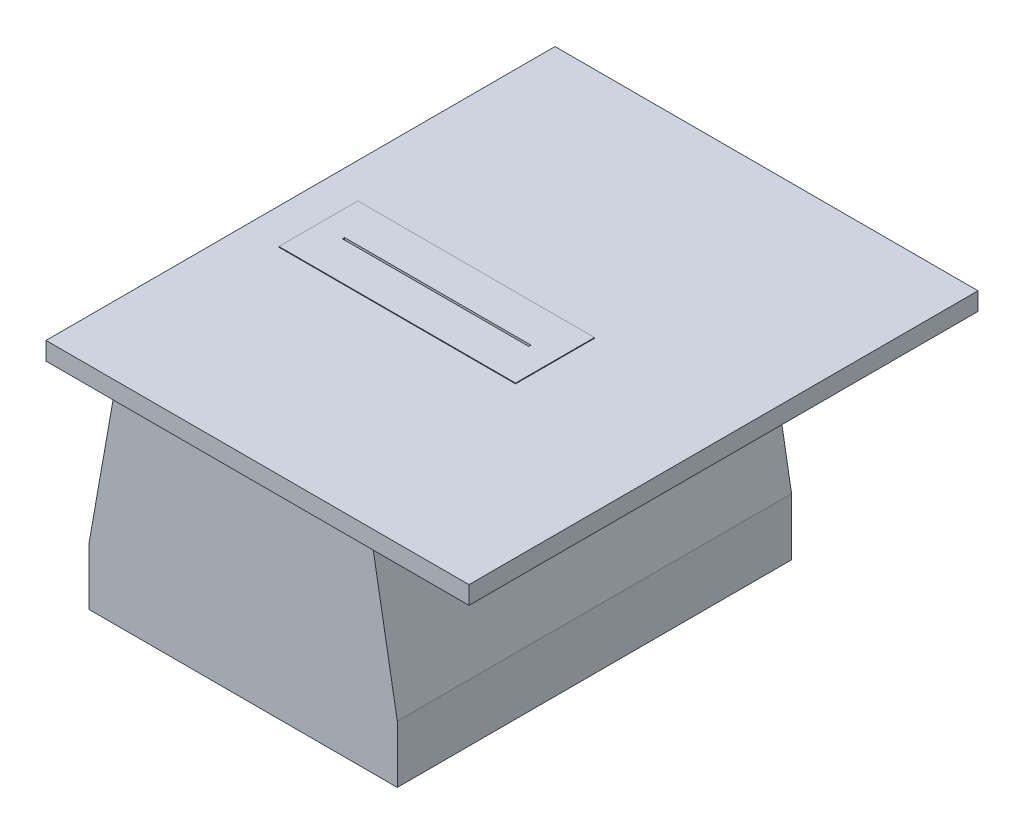
ISO-10303-21;
HEADER;
FILE_DESCRIPTION(('STEP AP214'),'2;1');
FILE_NAME('part.step','',(''),(''),'','','');
FILE_SCHEMA(('AUTOMOTIVE_DESIGN { 1 0 10303 214 1 1 1 1 }'));
ENDSEC;
DATA;
#1=APPLICATION_CONTEXT('core data for automotive mechanical design processes');
#2=APPLICATION_PROTOCOL_DEFINITION('international standard','automotive_design',2000,#1);
#3=PRODUCT_CONTEXT('',#1,'mechanical');
#4=PRODUCT('Part','Part','',(#3));
#5=PRODUCT_RELATED_PRODUCT_CATEGORY('part','',(#4));
#6=PRODUCT_DEFINITION_FORMATION('','',#4);
#7=PRODUCT_DEFINITION_CONTEXT('part definition',#1,'design');
#8=PRODUCT_DEFINITION('design','',#6,#7);
#9=PRODUCT_DEFINITION_SHAPE('','',#8);
#10=(LENGTH_UNIT() NAMED_UNIT(*) SI_UNIT(.MILLI.,.METRE.));
#11=(NAMED_UNIT(*) PLANE_ANGLE_UNIT() SI_UNIT($,.RADIAN.));
#12=(NAMED_UNIT(*) SI_UNIT($,.STERADIAN.) SOLID_ANGLE_UNIT());
#13=UNCERTAINTY_MEASURE_WITH_UNIT(LENGTH_MEASURE(1.E-05),#10,'distance_accuracy_value','');
#14=(GEOMETRIC_REPRESENTATION_CONTEXT(3) GLOBAL_UNCERTAINTY_ASSIGNED_CONTEXT((#13)) GLOBAL_UNIT_ASSIGNED_CONTEXT((#10,
#11,#12)) REPRESENTATION_CONTEXT('',''));
#15=CARTESIAN_POINT('',(0.,0.,0.));
#16=DIRECTION('',(0.,0.,1.));
#17=DIRECTION('',(1.,0.,0.));
#18=AXIS2_PLACEMENT_3D('',#15,#16,#17);
#19=CARTESIAN_POINT('',(215.,0.,550.));
#20=DIRECTION('',(-1.,0.,0.));
#21=DIRECTION('',(0.,-1.,0.));
#22=AXIS2_PLACEMENT_3D('',#19,#20,#21);
#23=PLANE('',#22);
#24=DIRECTION('',(0.,1.,0.));
#25=VECTOR('',#24,1.);
#26=CARTESIAN_POINT('',(215.,0.,0.));
#27=LINE('',#26,#25);
#28=CARTESIAN_POINT('',(215.,0.,0.));
#29=VERTEX_POINT('',#28);
#30=CARTESIAN_POINT('',(215.,80.0000000000001,0.));
#31=VERTEX_POINT('',#30);
#32=EDGE_CURVE('E255',#29,#31,#27,.T.);
#33=ORIENTED_EDGE('',*,*,#32,.T.);
#34=DIRECTION('',(0.,0.,-1.));
#35=VECTOR('',#34,1.);
#36=CARTESIAN_POINT('',(215.,80.0000000000001,550.));
#37=LINE('',#36,#35);
#38=CARTESIAN_POINT('',(215.,80.0000000000001,550.));
#39=VERTEX_POINT('',#38);
#40=EDGE_CURVE('E11',#39,#31,#37,.T.);
#41=ORIENTED_EDGE('',*,*,#40,.F.);
#42=DIRECTION('',(0.,1.,0.));
#43=VECTOR('',#42,1.);
#44=CARTESIAN_POINT('',(215.,0.,550.));
#45=LINE('',#44,#43);
#46=CARTESIAN_POINT('',(215.,0.,550.));
#47=VERTEX_POINT('',#46);
#48=EDGE_CURVE('E256',#47,#39,#45,.T.);
#49=ORIENTED_EDGE('',*,*,#48,.F.);
#50=DIRECTION('',(0.,0.,-1.));
#51=VECTOR('',#50,1.);
#52=CARTESIAN_POINT('',(215.,0.,550.));
#53=LINE('',#52,#51);
#54=EDGE_CURVE('E270',#47,#29,#53,.T.);
#55=ORIENTED_EDGE('',*,*,#54,.T.);
#56=EDGE_LOOP('',(#33,#41,#49,#55));
#57=FACE_BOUND('',#56,.T.);
#58=ADVANCED_FACE('F33',(#57),#23,.F.);
#59=CARTESIAN_POINT('',(215.,80.0000000000001,550.));
#60=DIRECTION('',(-0.984807753012208,-0.173648177666931,0.));
#61=DIRECTION('',(0.173648177666931,-0.984807753012208,0.));
#62=AXIS2_PLACEMENT_3D('',#59,#60,#61);
#63=PLANE('',#62);
#64=DIRECTION('',(-0.173648177666931,0.984807753012208,0.));
#65=VECTOR('',#64,1.);
#66=CARTESIAN_POINT('',(215.,80.0000000000001,0.));
#67=LINE('',#66,#65);
#68=CARTESIAN_POINT('',(176.208064244138,300.,0.));
#69=VERTEX_POINT('',#68);
#70=EDGE_CURVE('E273',#31,#69,#67,.T.);
#71=ORIENTED_EDGE('',*,*,#70,.T.);
#72=DIRECTION('',(0.,0.,-1.));
#73=VECTOR('',#72,1.);
#74=CARTESIAN_POINT('',(176.208064244138,300.,550.));
#75=LINE('',#74,#73);
#76=CARTESIAN_POINT('',(176.208064244138,300.,550.));
#77=VERTEX_POINT('',#76);
#78=EDGE_CURVE('E40',#77,#69,#75,.T.);
#79=ORIENTED_EDGE('',*,*,#78,.F.);
#80=DIRECTION('',(-0.173648177666931,0.984807753012208,0.));
#81=VECTOR('',#80,1.);
#82=CARTESIAN_POINT('',(215.,80.0000000000001,550.));
#83=LINE('',#82,#81);
#84=EDGE_CURVE('E259',#39,#77,#83,.T.);
#85=ORIENTED_EDGE('',*,*,#84,.F.);
#86=ORIENTED_EDGE('',*,*,#40,.T.);
#87=EDGE_LOOP('',(#71,#79,#85,#86));
#88=FACE_BOUND('',#87,.T.);
#89=ADVANCED_FACE('F300',(#88),#63,.F.);
#90=CARTESIAN_POINT('',(-215.,80.,550.));
#91=DIRECTION('',(0.984807753012208,-0.173648177666931,0.));
#92=DIRECTION('',(0.173648177666931,0.984807753012208,0.));
#93=AXIS2_PLACEMENT_3D('',#90,#91,#92);
#94=PLANE('',#93);
#95=DIRECTION('',(-0.173648177666931,-0.984807753012208,0.));
#96=VECTOR('',#95,1.);
#97=CARTESIAN_POINT('',(-215.,80.,0.));
#98=LINE('',#97,#96);
#99=CARTESIAN_POINT('',(-176.208064244138,300.,0.));
#100=VERTEX_POINT('',#99);
#101=CARTESIAN_POINT('',(-215.,80.,0.));
#102=VERTEX_POINT('',#101);
#103=EDGE_CURVE('E279',#100,#102,#98,.T.);
#104=ORIENTED_EDGE('',*,*,#103,.T.);
#105=DIRECTION('',(0.,0.,-1.));
#106=VECTOR('',#105,1.);
#107=CARTESIAN_POINT('',(-215.,80.,550.));
#108=LINE('',#107,#106);
#109=CARTESIAN_POINT('',(-215.,80.,550.));
#110=VERTEX_POINT('',#109);
#111=EDGE_CURVE('E289',#110,#102,#108,.T.);
#112=ORIENTED_EDGE('',*,*,#111,.F.);
#113=DIRECTION('',(-0.173648177666931,-0.984807753012208,0.));
#114=VECTOR('',#113,1.);
#115=CARTESIAN_POINT('',(-215.,80.,550.));
#116=LINE('',#115,#114);
#117=CARTESIAN_POINT('',(-176.208064244138,300.,550.));
#118=VERTEX_POINT('',#117);
#119=EDGE_CURVE('E264',#118,#110,#116,.T.);
#120=ORIENTED_EDGE('',*,*,#119,.F.);
#121=DIRECTION('',(0.,0.,-1.));
#122=VECTOR('',#121,1.);
#123=CARTESIAN_POINT('',(-176.208064244138,300.,550.));
#124=LINE('',#123,#122);
#125=EDGE_CURVE('E292',#118,#100,#124,.T.);
#126=ORIENTED_EDGE('',*,*,#125,.T.);
#127=EDGE_LOOP('',(#104,#112,#120,#126));
#128=FACE_BOUND('',#127,.T.);
#129=ADVANCED_FACE('F310',(#128),#94,.F.);
#130=CARTESIAN_POINT('',(-215.,0.,550.));
#131=DIRECTION('',(1.,0.,0.));
#132=DIRECTION('',(0.,1.,0.));
#133=AXIS2_PLACEMENT_3D('',#130,#131,#132);
#134=PLANE('',#133);
#135=DIRECTION('',(0.,-1.,0.));
#136=VECTOR('',#135,1.);
#137=CARTESIAN_POINT('',(-215.,0.,0.));
#138=LINE('',#137,#136);
#139=CARTESIAN_POINT('',(-215.,0.,0.));
#140=VERTEX_POINT('',#139);
#141=EDGE_CURVE('E281',#102,#140,#138,.T.);
#142=ORIENTED_EDGE('',*,*,#141,.T.);
#143=DIRECTION('',(0.,0.,-1.));
#144=VECTOR('',#143,1.);
#145=CARTESIAN_POINT('',(-215.,0.,550.));
#146=LINE('',#145,#144);
#147=CARTESIAN_POINT('',(-215.,0.,550.));
#148=VERTEX_POINT('',#147);
#149=EDGE_CURVE('E286',#148,#140,#146,.T.);
#150=ORIENTED_EDGE('',*,*,#149,.F.);
#151=DIRECTION('',(0.,-1.,0.));
#152=VECTOR('',#151,1.);
#153=CARTESIAN_POINT('',(-215.,0.,550.));
#154=LINE('',#153,#152);
#155=EDGE_CURVE('E266',#110,#148,#154,.T.);
#156=ORIENTED_EDGE('',*,*,#155,.F.);
#157=ORIENTED_EDGE('',*,*,#111,.T.);
#158=EDGE_LOOP('',(#142,#150,#156,#157));
#159=FACE_BOUND('',#158,.T.);
#160=ADVANCED_FACE('F314',(#159),#134,.F.);
#161=CARTESIAN_POINT('',(-215.,0.,550.));
#162=DIRECTION('',(0.,1.,0.));
#163=DIRECTION('',(-1.,0.,0.));
#164=AXIS2_PLACEMENT_3D('',#161,#162,#163);
#165=PLANE('',#164);
#166=DIRECTION('',(1.,0.,0.));
#167=VECTOR('',#166,1.);
#168=CARTESIAN_POINT('',(-215.,0.,0.));
#169=LINE('',#168,#167);
#170=EDGE_CURVE('E260',#140,#29,#169,.T.);
#171=ORIENTED_EDGE('',*,*,#170,.T.);
#172=ORIENTED_EDGE('',*,*,#54,.F.);
#173=DIRECTION('',(1.,0.,0.));
#174=VECTOR('',#173,1.);
#175=CARTESIAN_POINT('',(-215.,0.,550.));
#176=LINE('',#175,#174);
#177=EDGE_CURVE('E268',#148,#47,#176,.T.);
#178=ORIENTED_EDGE('',*,*,#177,.F.);
#179=ORIENTED_EDGE('',*,*,#149,.T.);
#180=EDGE_LOOP('',(#171,#172,#178,#179));
#181=FACE_BOUND('',#180,.T.);
#182=ADVANCED_FACE('F323',(#181),#165,.F.);
#183=CARTESIAN_POINT('',(0.,0.,550.));
#184=DIRECTION('',(0.,0.,1.));
#185=DIRECTION('',(1.,0.,0.));
#186=AXIS2_PLACEMENT_3D('',#183,#184,#185);
#187=PLANE('',#186);
#188=ORIENTED_EDGE('',*,*,#48,.T.);
#189=ORIENTED_EDGE('',*,*,#84,.T.);
#190=DIRECTION('',(-1.,0.,0.));
#191=VECTOR('',#190,1.);
#192=CARTESIAN_POINT('',(176.208064244138,300.,550.));
#193=LINE('',#192,#191);
#194=EDGE_CURVE('E262',#77,#118,#193,.T.);
#195=ORIENTED_EDGE('',*,*,#194,.T.);
#196=ORIENTED_EDGE('',*,*,#119,.T.);
#197=ORIENTED_EDGE('',*,*,#155,.T.);
#198=ORIENTED_EDGE('',*,*,#177,.T.);
#199=EDGE_LOOP('',(#188,#189,#195,#196,#197,#198));
#200=FACE_BOUND('',#199,.T.);
#201=ADVANCED_FACE('F318',(#200),#187,.T.);
#202=CARTESIAN_POINT('',(0.,0.,0.));
#203=DIRECTION('',(0.,0.,1.));
#204=DIRECTION('',(1.,0.,0.));
#205=AXIS2_PLACEMENT_3D('',#202,#203,#204);
#206=PLANE('',#205);
#207=ORIENTED_EDGE('',*,*,#32,.F.);
#208=ORIENTED_EDGE('',*,*,#170,.F.);
#209=ORIENTED_EDGE('',*,*,#141,.F.);
#210=ORIENTED_EDGE('',*,*,#103,.F.);
#211=DIRECTION('',(-1.,0.,0.));
#212=VECTOR('',#211,1.);
#213=CARTESIAN_POINT('',(176.208064244138,300.,0.));
#214=LINE('',#213,#212);
#215=EDGE_CURVE('E276',#69,#100,#214,.T.);
#216=ORIENTED_EDGE('',*,*,#215,.F.);
#217=ORIENTED_EDGE('',*,*,#70,.F.);
#218=EDGE_LOOP('',(#207,#208,#209,#210,#216,#217));
#219=FACE_BOUND('',#218,.T.);
#220=ADVANCED_FACE('F304',(#219),#206,.F.);
#221=CARTESIAN_POINT('',(0.,300.,0.));
#222=DIRECTION('',(0.,1.,0.));
#223=DIRECTION('',(-1.,0.,0.));
#224=AXIS2_PLACEMENT_3D('',#221,#222,#223);
#225=PLANE('',#224);
#226=DIRECTION('',(0.,0.,-1.));
#227=VECTOR('',#226,1.);
#228=CARTESIAN_POINT('',(345.,300.,-130.));
#229=LINE('',#228,#227);
#230=CARTESIAN_POINT('',(345.,300.,580.));
#231=VERTEX_POINT('',#230);
#232=CARTESIAN_POINT('',(345.,300.,-130.));
#233=VERTEX_POINT('',#232);
#234=EDGE_CURVE('E225',#231,#233,#229,.T.);
#235=ORIENTED_EDGE('',*,*,#234,.F.);
#236=DIRECTION('',(1.,0.,0.));
#237=VECTOR('',#236,1.);
#238=CARTESIAN_POINT('',(-245.,300.,580.));
#239=LINE('',#238,#237);
#240=CARTESIAN_POINT('',(-245.,300.,580.));
#241=VERTEX_POINT('',#240);
#242=EDGE_CURVE('E230',#241,#231,#239,.T.);
#243=ORIENTED_EDGE('',*,*,#242,.F.);
#244=DIRECTION('',(0.,0.,1.));
#245=VECTOR('',#244,1.);
#246=CARTESIAN_POINT('',(-245.,300.,-130.));
#247=LINE('',#246,#245);
#248=CARTESIAN_POINT('',(-245.,300.,-130.));
#249=VERTEX_POINT('',#248);
#250=EDGE_CURVE('E241',#249,#241,#247,.T.);
#251=ORIENTED_EDGE('',*,*,#250,.F.);
#252=DIRECTION('',(-1.,0.,0.));
#253=VECTOR('',#252,1.);
#254=CARTESIAN_POINT('',(-245.,300.,-130.));
#255=LINE('',#254,#253);
#256=EDGE_CURVE('E239',#233,#249,#255,.T.);
#257=ORIENTED_EDGE('',*,*,#256,.F.);
#258=EDGE_LOOP('',(#235,#243,#251,#257));
#259=FACE_BOUND('',#258,.T.);
#260=ORIENTED_EDGE('',*,*,#78,.T.);
#261=ORIENTED_EDGE('',*,*,#215,.T.);
#262=ORIENTED_EDGE('',*,*,#125,.F.);
#263=ORIENTED_EDGE('',*,*,#194,.F.);
#264=EDGE_LOOP('',(#260,#261,#262,#263));
#265=FACE_BOUND('',#264,.T.);
#266=ADVANCED_FACE('F297',(#259,#265),#225,.F.);
#267=CARTESIAN_POINT('',(345.,325.,-130.));
#268=DIRECTION('',(-1.,0.,0.));
#269=DIRECTION('',(0.,-1.,0.));
#270=AXIS2_PLACEMENT_3D('',#267,#268,#269);
#271=PLANE('',#270);
#272=ORIENTED_EDGE('',*,*,#234,.T.);
#273=DIRECTION('',(0.,-1.,0.));
#274=VECTOR('',#273,1.);
#275=CARTESIAN_POINT('',(345.,325.,-130.));
#276=LINE('',#275,#274);
#277=CARTESIAN_POINT('',(345.,325.,-130.));
#278=VERTEX_POINT('',#277);
#279=EDGE_CURVE('E252',#278,#233,#276,.T.);
#280=ORIENTED_EDGE('',*,*,#279,.F.);
#281=DIRECTION('',(0.,0.,-1.));
#282=VECTOR('',#281,1.);
#283=CARTESIAN_POINT('',(345.,325.,-130.));
#284=LINE('',#283,#282);
#285=CARTESIAN_POINT('',(345.,325.,580.));
#286=VERTEX_POINT('',#285);
#287=EDGE_CURVE('E226',#286,#278,#284,.T.);
#288=ORIENTED_EDGE('',*,*,#287,.F.);
#289=DIRECTION('',(0.,-1.,0.));
#290=VECTOR('',#289,1.);
#291=CARTESIAN_POINT('',(345.,325.,580.));
#292=LINE('',#291,#290);
#293=EDGE_CURVE('E236',#286,#231,#292,.T.);
#294=ORIENTED_EDGE('',*,*,#293,.T.);
#295=EDGE_LOOP('',(#272,#280,#288,#294));
#296=FACE_BOUND('',#295,.T.);
#297=ADVANCED_FACE('F382',(#296),#271,.F.);
#298=CARTESIAN_POINT('',(-245.,325.,-130.));
#299=DIRECTION('',(0.,0.,1.));
#300=DIRECTION('',(1.,0.,0.));
#301=AXIS2_PLACEMENT_3D('',#298,#299,#300);
#302=PLANE('',#301);
#303=ORIENTED_EDGE('',*,*,#256,.T.);
#304=DIRECTION('',(0.,-1.,0.));
#305=VECTOR('',#304,1.);
#306=CARTESIAN_POINT('',(-245.,325.,-130.));
#307=LINE('',#306,#305);
#308=CARTESIAN_POINT('',(-245.,325.,-130.));
#309=VERTEX_POINT('',#308);
#310=EDGE_CURVE('E249',#309,#249,#307,.T.);
#311=ORIENTED_EDGE('',*,*,#310,.F.);
#312=DIRECTION('',(-1.,0.,0.));
#313=VECTOR('',#312,1.);
#314=CARTESIAN_POINT('',(-245.,325.,-130.));
#315=LINE('',#314,#313);
#316=EDGE_CURVE('E229',#278,#309,#315,.T.);
#317=ORIENTED_EDGE('',*,*,#316,.F.);
#318=ORIENTED_EDGE('',*,*,#279,.T.);
#319=EDGE_LOOP('',(#303,#311,#317,#318));
#320=FACE_BOUND('',#319,.T.);
#321=ADVANCED_FACE('F391',(#320),#302,.F.);
#322=CARTESIAN_POINT('',(-245.,325.,-130.));
#323=DIRECTION('',(1.,0.,0.));
#324=DIRECTION('',(0.,1.,0.));
#325=AXIS2_PLACEMENT_3D('',#322,#323,#324);
#326=PLANE('',#325);
#327=ORIENTED_EDGE('',*,*,#250,.T.);
#328=DIRECTION('',(0.,-1.,0.));
#329=VECTOR('',#328,1.);
#330=CARTESIAN_POINT('',(-245.,325.,580.));
#331=LINE('',#330,#329);
#332=CARTESIAN_POINT('',(-245.,325.,580.));
#333=VERTEX_POINT('',#332);
#334=EDGE_CURVE('E246',#333,#241,#331,.T.);
#335=ORIENTED_EDGE('',*,*,#334,.F.);
#336=DIRECTION('',(0.,0.,1.));
#337=VECTOR('',#336,1.);
#338=CARTESIAN_POINT('',(-245.,325.,-130.));
#339=LINE('',#338,#337);
#340=EDGE_CURVE('E232',#309,#333,#339,.T.);
#341=ORIENTED_EDGE('',*,*,#340,.F.);
#342=ORIENTED_EDGE('',*,*,#310,.T.);
#343=EDGE_LOOP('',(#327,#335,#341,#342));
#344=FACE_BOUND('',#343,.T.);
#345=ADVANCED_FACE('F400',(#344),#326,.F.);
#346=CARTESIAN_POINT('',(-245.,325.,580.));
#347=DIRECTION('',(0.,0.,-1.));
#348=DIRECTION('',(-1.,0.,0.));
#349=AXIS2_PLACEMENT_3D('',#346,#347,#348);
#350=PLANE('',#349);
#351=ORIENTED_EDGE('',*,*,#242,.T.);
#352=ORIENTED_EDGE('',*,*,#293,.F.);
#353=DIRECTION('',(1.,0.,0.));
#354=VECTOR('',#353,1.);
#355=CARTESIAN_POINT('',(-245.,325.,580.));
#356=LINE('',#355,#354);
#357=EDGE_CURVE('E234',#333,#286,#356,.T.);
#358=ORIENTED_EDGE('',*,*,#357,.F.);
#359=ORIENTED_EDGE('',*,*,#334,.T.);
#360=EDGE_LOOP('',(#351,#352,#358,#359));
#361=FACE_BOUND('',#360,.T.);
#362=ADVANCED_FACE('F409',(#361),#350,.F.);
#363=CARTESIAN_POINT('',(0.,325.,0.));
#364=DIRECTION('',(0.,1.,0.));
#365=DIRECTION('',(-1.,0.,0.));
#366=AXIS2_PLACEMENT_3D('',#363,#364,#365);
#367=PLANE('',#366);
#368=DIRECTION('',(0.,0.,1.));
#369=VECTOR('',#368,1.);
#370=CARTESIAN_POINT('',(-195.,325.,195.));
#371=LINE('',#370,#369);
#372=CARTESIAN_POINT('',(-195.,325.,195.));
#373=VERTEX_POINT('',#372);
#374=CARTESIAN_POINT('',(-195.,325.,305.));
#375=VERTEX_POINT('',#374);
#376=EDGE_CURVE('E55',#373,#375,#371,.T.);
#377=ORIENTED_EDGE('',*,*,#376,.F.);
#378=DIRECTION('',(-1.,0.,0.));
#379=VECTOR('',#378,1.);
#380=CARTESIAN_POINT('',(-195.,325.,195.));
#381=LINE('',#380,#379);
#382=CARTESIAN_POINT('',(135.,325.,195.));
#383=VERTEX_POINT('',#382);
#384=EDGE_CURVE('E199',#383,#373,#381,.T.);
#385=ORIENTED_EDGE('',*,*,#384,.F.);
#386=DIRECTION('',(0.,0.,-1.));
#387=VECTOR('',#386,1.);
#388=CARTESIAN_POINT('',(135.,325.,195.));
#389=LINE('',#388,#387);
#390=CARTESIAN_POINT('',(135.,325.,305.));
#391=VERTEX_POINT('',#390);
#392=EDGE_CURVE('E210',#391,#383,#389,.T.);
#393=ORIENTED_EDGE('',*,*,#392,.F.);
#394=DIRECTION('',(1.,0.,0.));
#395=VECTOR('',#394,1.);
#396=CARTESIAN_POINT('',(-195.,325.,305.));
#397=LINE('',#396,#395);
#398=EDGE_CURVE('E207',#375,#391,#397,.T.);
#399=ORIENTED_EDGE('',*,*,#398,.F.);
#400=EDGE_LOOP('',(#377,#385,#393,#399));
#401=FACE_BOUND('',#400,.T.);
#402=ORIENTED_EDGE('',*,*,#287,.T.);
#403=ORIENTED_EDGE('',*,*,#316,.T.);
#404=ORIENTED_EDGE('',*,*,#340,.T.);
#405=ORIENTED_EDGE('',*,*,#357,.T.);
#406=EDGE_LOOP('',(#402,#403,#404,#405));
#407=FACE_BOUND('',#406,.T.);
#408=ADVANCED_FACE('F418',(#401,#407),#367,.T.);
#409=CARTESIAN_POINT('',(-195.,326.,195.));
#410=DIRECTION('',(1.,0.,0.));
#411=DIRECTION('',(0.,1.,0.));
#412=AXIS2_PLACEMENT_3D('',#409,#410,#411);
#413=PLANE('',#412);
#414=ORIENTED_EDGE('',*,*,#376,.T.);
#415=DIRECTION('',(0.,-1.,0.));
#416=VECTOR('',#415,1.);
#417=CARTESIAN_POINT('',(-195.,326.,305.));
#418=LINE('',#417,#416);
#419=CARTESIAN_POINT('',(-195.,326.,305.));
#420=VERTEX_POINT('',#419);
#421=EDGE_CURVE('E222',#420,#375,#418,.T.);
#422=ORIENTED_EDGE('',*,*,#421,.F.);
#423=DIRECTION('',(0.,0.,1.));
#424=VECTOR('',#423,1.);
#425=CARTESIAN_POINT('',(-195.,326.,195.));
#426=LINE('',#425,#424);
#427=CARTESIAN_POINT('',(-195.,326.,195.));
#428=VERTEX_POINT('',#427);
#429=EDGE_CURVE('E195',#428,#420,#426,.T.);
#430=ORIENTED_EDGE('',*,*,#429,.F.);
#431=DIRECTION('',(0.,-1.,0.));
#432=VECTOR('',#431,1.);
#433=CARTESIAN_POINT('',(-195.,326.,195.));
#434=LINE('',#433,#432);
#435=EDGE_CURVE('E205',#428,#373,#434,.T.);
#436=ORIENTED_EDGE('',*,*,#435,.T.);
#437=EDGE_LOOP('',(#414,#422,#430,#436));
#438=FACE_BOUND('',#437,.T.);
#439=ADVANCED_FACE('F427',(#438),#413,.F.);
#440=CARTESIAN_POINT('',(-195.,326.,305.));
#441=DIRECTION('',(0.,0.,-1.));
#442=DIRECTION('',(0.,1.,0.));
#443=AXIS2_PLACEMENT_3D('',#440,#441,#442);
#444=PLANE('',#443);
#445=ORIENTED_EDGE('',*,*,#398,.T.);
#446=DIRECTION('',(0.,-1.,0.));
#447=VECTOR('',#446,1.);
#448=CARTESIAN_POINT('',(135.,326.,305.));
#449=LINE('',#448,#447);
#450=CARTESIAN_POINT('',(135.,326.,305.));
#451=VERTEX_POINT('',#450);
#452=EDGE_CURVE('E219',#451,#391,#449,.T.);
#453=ORIENTED_EDGE('',*,*,#452,.F.);
#454=DIRECTION('',(1.,0.,0.));
#455=VECTOR('',#454,1.);
#456=CARTESIAN_POINT('',(-195.,326.,305.));
#457=LINE('',#456,#455);
#458=EDGE_CURVE('E198',#420,#451,#457,.T.);
#459=ORIENTED_EDGE('',*,*,#458,.F.);
#460=ORIENTED_EDGE('',*,*,#421,.T.);
#461=EDGE_LOOP('',(#445,#453,#459,#460));
#462=FACE_BOUND('',#461,.T.);
#463=ADVANCED_FACE('F435',(#462),#444,.F.);
#464=CARTESIAN_POINT('',(135.,326.,195.));
#465=DIRECTION('',(-1.,0.,0.));
#466=DIRECTION('',(0.,-1.,0.));
#467=AXIS2_PLACEMENT_3D('',#464,#465,#466);
#468=PLANE('',#467);
#469=ORIENTED_EDGE('',*,*,#392,.T.);
#470=DIRECTION('',(0.,-1.,0.));
#471=VECTOR('',#470,1.);
#472=CARTESIAN_POINT('',(135.,326.,195.));
#473=LINE('',#472,#471);
#474=CARTESIAN_POINT('',(135.,326.,195.));
#475=VERTEX_POINT('',#474);
#476=EDGE_CURVE('E216',#475,#383,#473,.T.);
#477=ORIENTED_EDGE('',*,*,#476,.F.);
#478=DIRECTION('',(0.,0.,-1.));
#479=VECTOR('',#478,1.);
#480=CARTESIAN_POINT('',(135.,326.,195.));
#481=LINE('',#480,#479);
#482=EDGE_CURVE('E201',#451,#475,#481,.T.);
#483=ORIENTED_EDGE('',*,*,#482,.F.);
#484=ORIENTED_EDGE('',*,*,#452,.T.);
#485=EDGE_LOOP('',(#469,#477,#483,#484));
#486=FACE_BOUND('',#485,.T.);
#487=ADVANCED_FACE('F444',(#486),#468,.F.);
#488=CARTESIAN_POINT('',(-195.,326.,195.));
#489=DIRECTION('',(0.,0.,1.));
#490=DIRECTION('',(1.,0.,0.));
#491=AXIS2_PLACEMENT_3D('',#488,#489,#490);
#492=PLANE('',#491);
#493=ORIENTED_EDGE('',*,*,#384,.T.);
#494=ORIENTED_EDGE('',*,*,#435,.F.);
#495=DIRECTION('',(-1.,0.,0.));
#496=VECTOR('',#495,1.);
#497=CARTESIAN_POINT('',(-195.,326.,195.));
#498=LINE('',#497,#496);
#499=EDGE_CURVE('E203',#475,#428,#498,.T.);
#500=ORIENTED_EDGE('',*,*,#499,.F.);
#501=ORIENTED_EDGE('',*,*,#476,.T.);
#502=EDGE_LOOP('',(#493,#494,#500,#501));
#503=FACE_BOUND('',#502,.T.);
#504=ADVANCED_FACE('F453',(#503),#492,.F.);
#505=CARTESIAN_POINT('',(0.,326.,0.));
#506=DIRECTION('',(0.,1.,0.));
#507=DIRECTION('',(-1.,0.,0.));
#508=AXIS2_PLACEMENT_3D('',#505,#506,#507);
#509=PLANE('',#508);
#510=DIRECTION('',(0.,0.,1.));
#511=VECTOR('',#510,1.);
#512=CARTESIAN_POINT('',(-160.,326.,248.5));
#513=LINE('',#512,#511);
#514=CARTESIAN_POINT('',(-160.,326.,248.5));
#515=VERTEX_POINT('',#514);
#516=CARTESIAN_POINT('',(-160.,326.,251.5));
#517=VERTEX_POINT('',#516);
#518=EDGE_CURVE('E47',#515,#517,#513,.T.);
#519=ORIENTED_EDGE('',*,*,#518,.F.);
#520=DIRECTION('',(-1.,0.,0.));
#521=VECTOR('',#520,1.);
#522=CARTESIAN_POINT('',(-160.,326.,248.5));
#523=LINE('',#522,#521);
#524=CARTESIAN_POINT('',(100.,326.,248.5));
#525=VERTEX_POINT('',#524);
#526=EDGE_CURVE('E177',#525,#515,#523,.T.);
#527=ORIENTED_EDGE('',*,*,#526,.F.);
#528=DIRECTION('',(0.,0.,-1.));
#529=VECTOR('',#528,1.);
#530=CARTESIAN_POINT('',(100.,326.,248.5));
#531=LINE('',#530,#529);
#532=CARTESIAN_POINT('',(100.,326.,251.5));
#533=VERTEX_POINT('',#532);
#534=EDGE_CURVE('E180',#533,#525,#531,.T.);
#535=ORIENTED_EDGE('',*,*,#534,.F.);
#536=DIRECTION('',(1.,0.,0.));
#537=VECTOR('',#536,1.);
#538=CARTESIAN_POINT('',(-160.,326.,251.5));
#539=LINE('',#538,#537);
#540=EDGE_CURVE('E186',#517,#533,#539,.T.);
#541=ORIENTED_EDGE('',*,*,#540,.F.);
#542=EDGE_LOOP('',(#519,#527,#535,#541));
#543=FACE_BOUND('',#542,.T.);
#544=ORIENTED_EDGE('',*,*,#429,.T.);
#545=ORIENTED_EDGE('',*,*,#458,.T.);
#546=ORIENTED_EDGE('',*,*,#482,.T.);
#547=ORIENTED_EDGE('',*,*,#499,.T.);
#548=EDGE_LOOP('',(#544,#545,#546,#547));
#549=FACE_BOUND('',#548,.T.);
#550=ADVANCED_FACE('F462',(#543,#549),#509,.T.);
#551=CARTESIAN_POINT('',(-160.,323.,248.5));
#552=DIRECTION('',(-1.,0.,0.));
#553=DIRECTION('',(0.,-1.,0.));
#554=AXIS2_PLACEMENT_3D('',#551,#552,#553);
#555=PLANE('',#554);
#556=ORIENTED_EDGE('',*,*,#518,.T.);
#557=DIRECTION('',(0.,1.,0.));
#558=VECTOR('',#557,1.);
#559=CARTESIAN_POINT('',(-160.,323.,251.5));
#560=LINE('',#559,#558);
#561=CARTESIAN_POINT('',(-160.,323.,251.5));
#562=VERTEX_POINT('',#561);
#563=EDGE_CURVE('E155',#562,#517,#560,.T.);
#564=ORIENTED_EDGE('',*,*,#563,.F.);
#565=DIRECTION('',(0.,0.,1.));
#566=VECTOR('',#565,1.);
#567=CARTESIAN_POINT('',(-160.,323.,248.5));
#568=LINE('',#567,#566);
#569=CARTESIAN_POINT('',(-160.,323.,248.5));
#570=VERTEX_POINT('',#569);
#571=EDGE_CURVE('E159',#570,#562,#568,.T.);
#572=ORIENTED_EDGE('',*,*,#571,.F.);
#573=DIRECTION('',(0.,1.,0.));
#574=VECTOR('',#573,1.);
#575=CARTESIAN_POINT('',(-160.,323.,248.5));
#576=LINE('',#575,#574);
#577=EDGE_CURVE('E190',#570,#515,#576,.T.);
#578=ORIENTED_EDGE('',*,*,#577,.T.);
#579=EDGE_LOOP('',(#556,#564,#572,#578));
#580=FACE_BOUND('',#579,.T.);
#581=ADVANCED_FACE('F157',(#580),#555,.F.);
#582=CARTESIAN_POINT('',(-160.,323.,248.5));
#583=DIRECTION('',(0.,0.,-1.));
#584=DIRECTION('',(-1.,0.,0.));
#585=AXIS2_PLACEMENT_3D('',#582,#583,#584);
#586=PLANE('',#585);
#587=ORIENTED_EDGE('',*,*,#526,.T.);
#588=ORIENTED_EDGE('',*,*,#577,.F.);
#589=DIRECTION('',(-1.,0.,0.));
#590=VECTOR('',#589,1.);
#591=CARTESIAN_POINT('',(-160.,323.,248.5));
#592=LINE('',#591,#590);
#593=CARTESIAN_POINT('',(100.,323.,248.5));
#594=VERTEX_POINT('',#593);
#595=EDGE_CURVE('E165',#594,#570,#592,.T.);
#596=ORIENTED_EDGE('',*,*,#595,.F.);
#597=DIRECTION('',(0.,1.,0.));
#598=VECTOR('',#597,1.);
#599=CARTESIAN_POINT('',(100.,323.,248.5));
#600=LINE('',#599,#598);
#601=EDGE_CURVE('E192',#594,#525,#600,.T.);
#602=ORIENTED_EDGE('',*,*,#601,.T.);
#603=EDGE_LOOP('',(#587,#588,#596,#602));
#604=FACE_BOUND('',#603,.T.);
#605=ADVANCED_FACE('F479',(#604),#586,.F.);
#606=CARTESIAN_POINT('',(100.,323.,248.5));
#607=DIRECTION('',(1.,0.,0.));
#608=DIRECTION('',(0.,1.,0.));
#609=AXIS2_PLACEMENT_3D('',#606,#607,#608);
#610=PLANE('',#609);
#611=ORIENTED_EDGE('',*,*,#534,.T.);
#612=ORIENTED_EDGE('',*,*,#601,.F.);
#613=DIRECTION('',(0.,0.,-1.));
#614=VECTOR('',#613,1.);
#615=CARTESIAN_POINT('',(100.,323.,248.5));
#616=LINE('',#615,#614);
#617=CARTESIAN_POINT('',(100.,323.,251.5));
#618=VERTEX_POINT('',#617);
#619=EDGE_CURVE('E173',#618,#594,#616,.T.);
#620=ORIENTED_EDGE('',*,*,#619,.F.);
#621=DIRECTION('',(0.,1.,0.));
#622=VECTOR('',#621,1.);
#623=CARTESIAN_POINT('',(100.,323.,251.5));
#624=LINE('',#623,#622);
#625=EDGE_CURVE('E164',#618,#533,#624,.T.);
#626=ORIENTED_EDGE('',*,*,#625,.T.);
#627=EDGE_LOOP('',(#611,#612,#620,#626));
#628=FACE_BOUND('',#627,.T.);
#629=ADVANCED_FACE('F487',(#628),#610,.F.);
#630=CARTESIAN_POINT('',(-160.,323.,251.5));
#631=DIRECTION('',(0.,0.,1.));
#632=DIRECTION('',(1.,0.,0.));
#633=AXIS2_PLACEMENT_3D('',#630,#631,#632);
#634=PLANE('',#633);
#635=ORIENTED_EDGE('',*,*,#540,.T.);
#636=ORIENTED_EDGE('',*,*,#625,.F.);
#637=DIRECTION('',(1.,0.,0.));
#638=VECTOR('',#637,1.);
#639=CARTESIAN_POINT('',(-160.,323.,251.5));
#640=LINE('',#639,#638);
#641=EDGE_CURVE('E168',#562,#618,#640,.T.);
#642=ORIENTED_EDGE('',*,*,#641,.F.);
#643=ORIENTED_EDGE('',*,*,#563,.T.);
#644=EDGE_LOOP('',(#635,#636,#642,#643));
#645=FACE_BOUND('',#644,.T.);
#646=ADVANCED_FACE('F169',(#645),#634,.F.);
#647=CARTESIAN_POINT('',(0.,323.,0.));
#648=DIRECTION('',(0.,1.,0.));
#649=DIRECTION('',(0.,0.,1.));
#650=AXIS2_PLACEMENT_3D('',#647,#648,#649);
#651=PLANE('',#650);
#652=ORIENTED_EDGE('',*,*,#571,.T.);
#653=ORIENTED_EDGE('',*,*,#641,.T.);
#654=ORIENTED_EDGE('',*,*,#619,.T.);
#655=ORIENTED_EDGE('',*,*,#595,.T.);
#656=EDGE_LOOP('',(#652,#653,#654,#655));
#657=FACE_BOUND('',#656,.T.);
#658=ADVANCED_FACE('F175',(#657),#651,.T.);
#659=CLOSED_SHELL('',(#58,#89,#129,#160,#182,#201,#220,#266,#297,#321,#345,#362,#408,#439,#463,
#487,#504,#550,#581,#605,#629,#646,#658));
#660=MANIFOLD_SOLID_BREP('B2',#659);
#661=ADVANCED_BREP_SHAPE_REPRESENTATION('',(#18,#660),#14);
#662=SHAPE_DEFINITION_REPRESENTATION(#9,#661);
ENDSEC;
END-ISO-10303-21;
